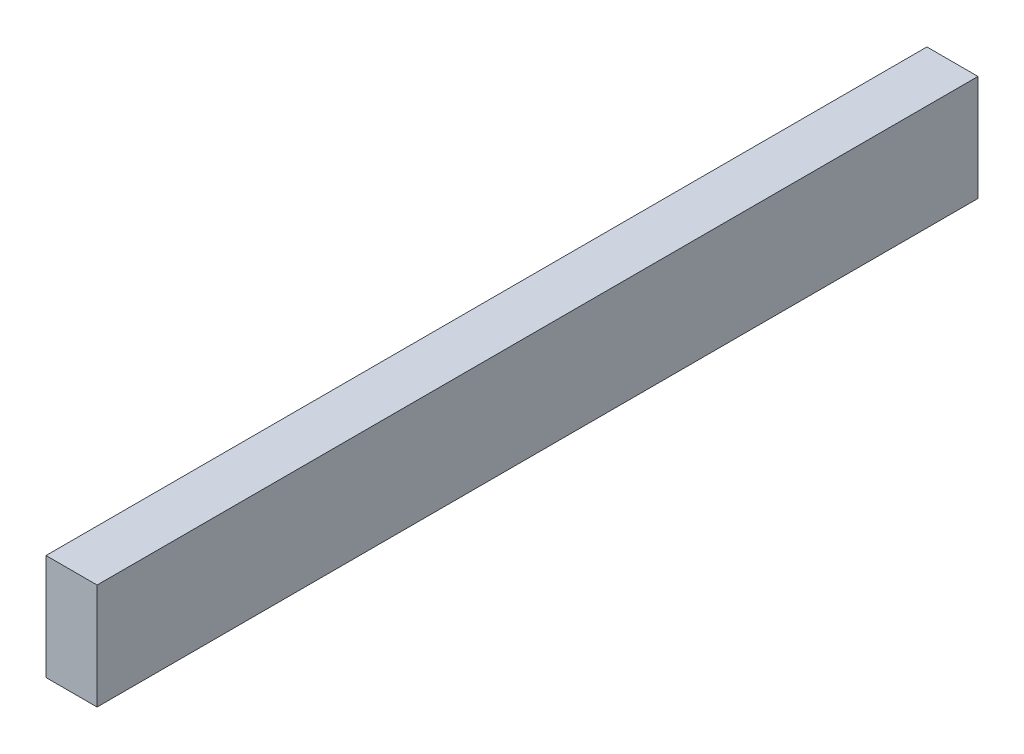
ISO-10303-21;
HEADER;
FILE_DESCRIPTION(('STEP AP214'),'2;1');
FILE_NAME('part.step','',(''),(''),'','','');
FILE_SCHEMA(('AUTOMOTIVE_DESIGN { 1 0 10303 214 1 1 1 1 }'));
ENDSEC;
DATA;
#1=APPLICATION_CONTEXT('core data for automotive mechanical design processes');
#2=APPLICATION_PROTOCOL_DEFINITION('international standard','automotive_design',2000,#1);
#3=PRODUCT_CONTEXT('',#1,'mechanical');
#4=PRODUCT('Part','Part','',(#3));
#5=PRODUCT_RELATED_PRODUCT_CATEGORY('part','',(#4));
#6=PRODUCT_DEFINITION_FORMATION('','',#4);
#7=PRODUCT_DEFINITION_CONTEXT('part definition',#1,'design');
#8=PRODUCT_DEFINITION('design','',#6,#7);
#9=PRODUCT_DEFINITION_SHAPE('','',#8);
#10=(LENGTH_UNIT() NAMED_UNIT(*) SI_UNIT(.MILLI.,.METRE.));
#11=(NAMED_UNIT(*) PLANE_ANGLE_UNIT() SI_UNIT($,.RADIAN.));
#12=(NAMED_UNIT(*) SI_UNIT($,.STERADIAN.) SOLID_ANGLE_UNIT());
#13=UNCERTAINTY_MEASURE_WITH_UNIT(LENGTH_MEASURE(1.E-05),#10,'distance_accuracy_value','');
#14=(GEOMETRIC_REPRESENTATION_CONTEXT(3) GLOBAL_UNCERTAINTY_ASSIGNED_CONTEXT((#13)) GLOBAL_UNIT_ASSIGNED_CONTEXT((#10,
#11,#12)) REPRESENTATION_CONTEXT('',''));
#15=CARTESIAN_POINT('',(0.,0.,0.));
#16=DIRECTION('',(0.,0.,1.));
#17=DIRECTION('',(1.,0.,0.));
#18=AXIS2_PLACEMENT_3D('',#15,#16,#17);
#19=CARTESIAN_POINT('',(0.,0.,500.));
#20=DIRECTION('',(1.,0.,0.));
#21=DIRECTION('',(0.,0.,-1.));
#22=AXIS2_PLACEMENT_3D('',#19,#20,#21);
#23=PLANE('',#22);
#24=DIRECTION('',(0.,-1.,0.));
#25=VECTOR('',#24,1.);
#26=CARTESIAN_POINT('',(0.,0.,0.));
#27=LINE('',#26,#25);
#28=CARTESIAN_POINT('',(0.,60.,0.));
#29=VERTEX_POINT('',#28);
#30=CARTESIAN_POINT('',(0.,0.,0.));
#31=VERTEX_POINT('',#30);
#32=EDGE_CURVE('E96',#29,#31,#27,.T.);
#33=ORIENTED_EDGE('',*,*,#32,.T.);
#34=DIRECTION('',(0.,0.,-1.));
#35=VECTOR('',#34,1.);
#36=CARTESIAN_POINT('',(0.,0.,500.));
#37=LINE('',#36,#35);
#38=CARTESIAN_POINT('',(0.,0.,500.));
#39=VERTEX_POINT('',#38);
#40=EDGE_CURVE('E11',#39,#31,#37,.T.);
#41=ORIENTED_EDGE('',*,*,#40,.F.);
#42=DIRECTION('',(0.,-1.,0.));
#43=VECTOR('',#42,1.);
#44=CARTESIAN_POINT('',(0.,0.,500.));
#45=LINE('',#44,#43);
#46=CARTESIAN_POINT('',(0.,60.,500.));
#47=VERTEX_POINT('',#46);
#48=EDGE_CURVE('E84',#47,#39,#45,.T.);
#49=ORIENTED_EDGE('',*,*,#48,.F.);
#50=DIRECTION('',(0.,0.,-1.));
#51=VECTOR('',#50,1.);
#52=CARTESIAN_POINT('',(0.,60.,500.));
#53=LINE('',#52,#51);
#54=EDGE_CURVE('E92',#47,#29,#53,.T.);
#55=ORIENTED_EDGE('',*,*,#54,.T.);
#56=EDGE_LOOP('',(#33,#41,#49,#55));
#57=FACE_BOUND('',#56,.T.);
#58=ADVANCED_FACE('F33',(#57),#23,.F.);
#59=CARTESIAN_POINT('',(0.,0.,500.));
#60=DIRECTION('',(0.,1.,0.));
#61=DIRECTION('',(0.,0.,1.));
#62=AXIS2_PLACEMENT_3D('',#59,#60,#61);
#63=PLANE('',#62);
#64=DIRECTION('',(1.,0.,0.));
#65=VECTOR('',#64,1.);
#66=CARTESIAN_POINT('',(0.,0.,0.));
#67=LINE('',#66,#65);
#68=CARTESIAN_POINT('',(29.,0.,0.));
#69=VERTEX_POINT('',#68);
#70=EDGE_CURVE('E88',#31,#69,#67,.T.);
#71=ORIENTED_EDGE('',*,*,#70,.T.);
#72=DIRECTION('',(0.,0.,-1.));
#73=VECTOR('',#72,1.);
#74=CARTESIAN_POINT('',(29.,0.,500.));
#75=LINE('',#74,#73);
#76=CARTESIAN_POINT('',(29.,0.,500.));
#77=VERTEX_POINT('',#76);
#78=EDGE_CURVE('E41',#77,#69,#75,.T.);
#79=ORIENTED_EDGE('',*,*,#78,.F.);
#80=DIRECTION('',(1.,0.,0.));
#81=VECTOR('',#80,1.);
#82=CARTESIAN_POINT('',(0.,0.,500.));
#83=LINE('',#82,#81);
#84=EDGE_CURVE('E79',#39,#77,#83,.T.);
#85=ORIENTED_EDGE('',*,*,#84,.F.);
#86=ORIENTED_EDGE('',*,*,#40,.T.);
#87=EDGE_LOOP('',(#71,#79,#85,#86));
#88=FACE_BOUND('',#87,.T.);
#89=ADVANCED_FACE('F87',(#88),#63,.F.);
#90=CARTESIAN_POINT('',(29.,0.,500.));
#91=DIRECTION('',(-1.,0.,0.));
#92=DIRECTION('',(0.,0.,1.));
#93=AXIS2_PLACEMENT_3D('',#90,#91,#92);
#94=PLANE('',#93);
#95=DIRECTION('',(0.,1.,0.));
#96=VECTOR('',#95,1.);
#97=CARTESIAN_POINT('',(29.,0.,0.));
#98=LINE('',#97,#96);
#99=CARTESIAN_POINT('',(29.,60.,0.));
#100=VERTEX_POINT('',#99);
#101=EDGE_CURVE('E66',#69,#100,#98,.T.);
#102=ORIENTED_EDGE('',*,*,#101,.T.);
#103=DIRECTION('',(0.,0.,-1.));
#104=VECTOR('',#103,1.);
#105=CARTESIAN_POINT('',(29.,60.,500.));
#106=LINE('',#105,#104);
#107=CARTESIAN_POINT('',(29.,60.,500.));
#108=VERTEX_POINT('',#107);
#109=EDGE_CURVE('E89',#108,#100,#106,.T.);
#110=ORIENTED_EDGE('',*,*,#109,.F.);
#111=DIRECTION('',(0.,1.,0.));
#112=VECTOR('',#111,1.);
#113=CARTESIAN_POINT('',(29.,0.,500.));
#114=LINE('',#113,#112);
#115=EDGE_CURVE('E82',#77,#108,#114,.T.);
#116=ORIENTED_EDGE('',*,*,#115,.F.);
#117=ORIENTED_EDGE('',*,*,#78,.T.);
#118=EDGE_LOOP('',(#102,#110,#116,#117));
#119=FACE_BOUND('',#118,.T.);
#120=ADVANCED_FACE('F90',(#119),#94,.F.);
#121=CARTESIAN_POINT('',(0.,60.,500.));
#122=DIRECTION('',(0.,-1.,0.));
#123=DIRECTION('',(0.,0.,-1.));
#124=AXIS2_PLACEMENT_3D('',#121,#122,#123);
#125=PLANE('',#124);
#126=DIRECTION('',(-1.,0.,0.));
#127=VECTOR('',#126,1.);
#128=CARTESIAN_POINT('',(0.,60.,0.));
#129=LINE('',#128,#127);
#130=EDGE_CURVE('E72',#100,#29,#129,.T.);
#131=ORIENTED_EDGE('',*,*,#130,.T.);
#132=ORIENTED_EDGE('',*,*,#54,.F.);
#133=DIRECTION('',(-1.,0.,0.));
#134=VECTOR('',#133,1.);
#135=CARTESIAN_POINT('',(0.,60.,500.));
#136=LINE('',#135,#134);
#137=EDGE_CURVE('E49',#108,#47,#136,.T.);
#138=ORIENTED_EDGE('',*,*,#137,.F.);
#139=ORIENTED_EDGE('',*,*,#109,.T.);
#140=EDGE_LOOP('',(#131,#132,#138,#139));
#141=FACE_BOUND('',#140,.T.);
#142=ADVANCED_FACE('F103',(#141),#125,.F.);
#143=CARTESIAN_POINT('',(0.,0.,500.));
#144=DIRECTION('',(0.,0.,-1.));
#145=DIRECTION('',(-1.,0.,0.));
#146=AXIS2_PLACEMENT_3D('',#143,#144,#145);
#147=PLANE('',#146);
#148=ORIENTED_EDGE('',*,*,#48,.T.);
#149=ORIENTED_EDGE('',*,*,#84,.T.);
#150=ORIENTED_EDGE('',*,*,#115,.T.);
#151=ORIENTED_EDGE('',*,*,#137,.T.);
#152=EDGE_LOOP('',(#148,#149,#150,#151));
#153=FACE_BOUND('',#152,.T.);
#154=ADVANCED_FACE('F80',(#153),#147,.F.);
#155=CARTESIAN_POINT('',(0.,0.,0.));
#156=DIRECTION('',(0.,0.,-1.));
#157=DIRECTION('',(-1.,0.,0.));
#158=AXIS2_PLACEMENT_3D('',#155,#156,#157);
#159=PLANE('',#158);
#160=ORIENTED_EDGE('',*,*,#32,.F.);
#161=ORIENTED_EDGE('',*,*,#130,.F.);
#162=ORIENTED_EDGE('',*,*,#101,.F.);
#163=ORIENTED_EDGE('',*,*,#70,.F.);
#164=EDGE_LOOP('',(#160,#161,#162,#163));
#165=FACE_BOUND('',#164,.T.);
#166=ADVANCED_FACE('F106',(#165),#159,.T.);
#167=CLOSED_SHELL('',(#58,#89,#120,#142,#154,#166));
#168=MANIFOLD_SOLID_BREP('B2',#167);
#169=ADVANCED_BREP_SHAPE_REPRESENTATION('',(#18,#168),#14);
#170=SHAPE_DEFINITION_REPRESENTATION(#9,#169);
ENDSEC;
END-ISO-10303-21;
